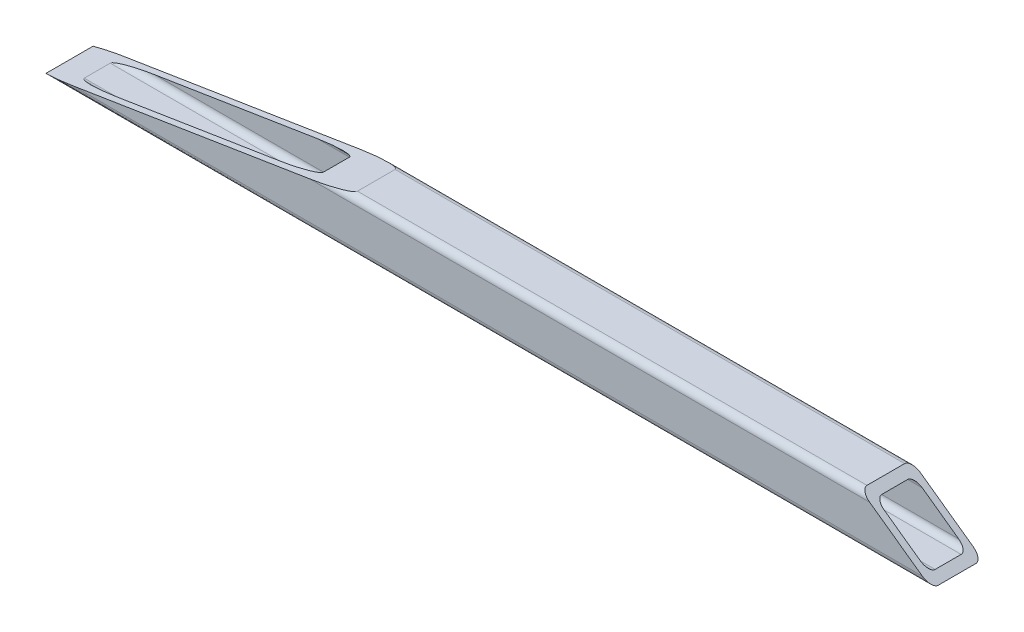
ISO-10303-21;
HEADER;
FILE_DESCRIPTION(('STEP AP214'),'2;1');
FILE_NAME('part.step','',(''),(''),'','','');
FILE_SCHEMA(('AUTOMOTIVE_DESIGN { 1 0 10303 214 1 1 1 1 }'));
ENDSEC;
DATA;
#1=APPLICATION_CONTEXT('core data for automotive mechanical design processes');
#2=APPLICATION_PROTOCOL_DEFINITION('international standard','automotive_design',2000,#1);
#3=PRODUCT_CONTEXT('',#1,'mechanical');
#4=PRODUCT('Part','Part','',(#3));
#5=PRODUCT_RELATED_PRODUCT_CATEGORY('part','',(#4));
#6=PRODUCT_DEFINITION_FORMATION('','',#4);
#7=PRODUCT_DEFINITION_CONTEXT('part definition',#1,'design');
#8=PRODUCT_DEFINITION('design','',#6,#7);
#9=PRODUCT_DEFINITION_SHAPE('','',#8);
#10=(LENGTH_UNIT() NAMED_UNIT(*) SI_UNIT(.MILLI.,.METRE.));
#11=(NAMED_UNIT(*) PLANE_ANGLE_UNIT() SI_UNIT($,.RADIAN.));
#12=(NAMED_UNIT(*) SI_UNIT($,.STERADIAN.) SOLID_ANGLE_UNIT());
#13=UNCERTAINTY_MEASURE_WITH_UNIT(LENGTH_MEASURE(1.E-05),#10,'distance_accuracy_value','');
#14=(GEOMETRIC_REPRESENTATION_CONTEXT(3) GLOBAL_UNCERTAINTY_ASSIGNED_CONTEXT((#13)) GLOBAL_UNIT_ASSIGNED_CONTEXT((#10,
#11,#12)) REPRESENTATION_CONTEXT('',''));
#15=CARTESIAN_POINT('',(0.,0.,0.));
#16=DIRECTION('',(0.,0.,1.));
#17=DIRECTION('',(1.,0.,0.));
#18=AXIS2_PLACEMENT_3D('',#15,#16,#17);
#19=CARTESIAN_POINT('',(442.722,5.25586659147798,-21.257866591478));
#20=DIRECTION('',(0.,0.,1.));
#21=DIRECTION('',(1.,0.,0.));
#22=AXIS2_PLACEMENT_3D('',#19,#20,#21);
#23=PLANE('',#22);
#24=DIRECTION('',(0.987493661121277,0.157658711288962,0.));
#25=VECTOR('',#24,1.);
#26=CARTESIAN_POINT('',(432.535852753679,69.0566915173771,-21.257866591478));
#27=LINE('',#26,#25);
#28=CARTESIAN_POINT('',(32.9200644883551,5.25586659147797,-21.257866591478));
#29=VERTEX_POINT('',#28);
#30=CARTESIAN_POINT('',(114.057305694897,18.209866591478,-21.257866591478));
#31=VERTEX_POINT('',#30);
#32=EDGE_CURVE('E11',#29,#31,#27,.T.);
#33=ORIENTED_EDGE('',*,*,#32,.F.);
#34=DIRECTION('',(-1.,0.,0.));
#35=VECTOR('',#34,1.);
#36=CARTESIAN_POINT('',(442.722,5.25586659147798,-21.257866591478));
#37=LINE('',#36,#35);
#38=CARTESIAN_POINT('',(434.013356726011,5.25586659147798,-21.257866591478));
#39=VERTEX_POINT('',#38);
#40=EDGE_CURVE('E205',#39,#29,#37,.T.);
#41=ORIENTED_EDGE('',*,*,#40,.F.);
#42=DIRECTION('',(0.813621194629576,-0.58139534883721,0.));
#43=VECTOR('',#42,1.);
#44=CARTESIAN_POINT('',(439.778299596407,1.13636848439306,-21.257866591478));
#45=LINE('',#44,#43);
#46=CARTESIAN_POINT('',(415.885160523012,18.209866591478,-21.257866591478));
#47=VERTEX_POINT('',#46);
#48=EDGE_CURVE('E42',#47,#39,#45,.T.);
#49=ORIENTED_EDGE('',*,*,#48,.F.);
#50=DIRECTION('',(-1.,0.,0.));
#51=VECTOR('',#50,1.);
#52=CARTESIAN_POINT('',(442.722,18.209866591478,-21.257866591478));
#53=LINE('',#52,#51);
#54=EDGE_CURVE('E212',#47,#31,#53,.T.);
#55=ORIENTED_EDGE('',*,*,#54,.T.);
#56=EDGE_LOOP('',(#33,#41,#49,#55));
#57=FACE_BOUND('',#56,.T.);
#58=ADVANCED_FACE('F34',(#57),#23,.T.);
#59=CARTESIAN_POINT('',(442.722,5.25586659147798,-18.209866591478));
#60=DIRECTION('',(-1.,0.,0.));
#61=DIRECTION('',(0.,0.,1.));
#62=AXIS2_PLACEMENT_3D('',#59,#60,#61);
#63=CYLINDRICAL_SURFACE('',#62,3.048);
#64=CARTESIAN_POINT('',(32.9200644883551,5.25586659147798,-18.209866591478));
#65=DIRECTION('',(0.157658711288962,-0.987493661121277,0.));
#66=DIRECTION('',(-0.987493661121277,-0.157658711288962,0.));
#67=AXIS2_PLACEMENT_3D('',#64,#65,#66);
#68=ELLIPSE('',#67,19.3328993690271,3.048);
#69=CARTESIAN_POINT('',(13.8289489103454,2.20786659147798,-18.209866591478));
#70=VERTEX_POINT('',#69);
#71=EDGE_CURVE('E263',#70,#29,#68,.T.);
#72=ORIENTED_EDGE('',*,*,#71,.F.);
#73=DIRECTION('',(-1.,0.,0.));
#74=VECTOR('',#73,1.);
#75=CARTESIAN_POINT('',(442.722,2.20786659147798,-18.209866591478));
#76=LINE('',#75,#74);
#77=CARTESIAN_POINT('',(438.278814656128,2.20786659147798,-18.209866591478));
#78=VERTEX_POINT('',#77);
#79=EDGE_CURVE('E207',#78,#70,#76,.T.);
#80=ORIENTED_EDGE('',*,*,#79,.F.);
#81=CARTESIAN_POINT('',(434.013356726011,5.25586659147798,-18.209866591478));
#82=DIRECTION('',(-0.58139534883721,-0.813621194629576,0.));
#83=DIRECTION('',(-0.813621194629576,0.58139534883721,0.));
#84=AXIS2_PLACEMENT_3D('',#81,#82,#83);
#85=ELLIPSE('',#84,5.24255999999999,3.048);
#86=EDGE_CURVE('E194',#39,#78,#85,.T.);
#87=ORIENTED_EDGE('',*,*,#86,.F.);
#88=ORIENTED_EDGE('',*,*,#40,.T.);
#89=EDGE_LOOP('',(#72,#80,#87,#88));
#90=FACE_BOUND('',#89,.T.);
#91=ADVANCED_FACE('F204',(#90),#63,.F.);
#92=CARTESIAN_POINT('',(442.722,2.20786659147798,-5.25586659147798));
#93=DIRECTION('',(0.,1.,0.));
#94=DIRECTION('',(0.,0.,1.));
#95=AXIS2_PLACEMENT_3D('',#92,#93,#94);
#96=PLANE('',#95);
#97=DIRECTION('',(0.,0.,-1.));
#98=VECTOR('',#97,1.);
#99=CARTESIAN_POINT('',(13.8289489103453,2.20786659147798,-5.25586659147798));
#100=LINE('',#99,#98);
#101=CARTESIAN_POINT('',(13.8289489103453,2.20786659147798,-5.25586659147798));
#102=VERTEX_POINT('',#101);
#103=EDGE_CURVE('E265',#102,#70,#100,.T.);
#104=ORIENTED_EDGE('',*,*,#103,.F.);
#105=DIRECTION('',(-1.,0.,0.));
#106=VECTOR('',#105,1.);
#107=CARTESIAN_POINT('',(442.722,2.20786659147798,-5.25586659147798));
#108=LINE('',#107,#106);
#109=CARTESIAN_POINT('',(438.278814656128,2.20786659147798,-5.25586659147798));
#110=VERTEX_POINT('',#109);
#111=EDGE_CURVE('E214',#110,#102,#108,.T.);
#112=ORIENTED_EDGE('',*,*,#111,.F.);
#113=DIRECTION('',(0.,0.,1.));
#114=VECTOR('',#113,1.);
#115=CARTESIAN_POINT('',(438.278814656128,2.20786659147798,-5.25586659147798));
#116=LINE('',#115,#114);
#117=EDGE_CURVE('E208',#78,#110,#116,.T.);
#118=ORIENTED_EDGE('',*,*,#117,.F.);
#119=ORIENTED_EDGE('',*,*,#79,.T.);
#120=EDGE_LOOP('',(#104,#112,#118,#119));
#121=FACE_BOUND('',#120,.T.);
#122=ADVANCED_FACE('F328',(#121),#96,.T.);
#123=CARTESIAN_POINT('',(442.722,5.25586659147798,-5.25586659147798));
#124=DIRECTION('',(-1.,0.,0.));
#125=DIRECTION('',(0.,0.,1.));
#126=AXIS2_PLACEMENT_3D('',#123,#124,#125);
#127=CYLINDRICAL_SURFACE('',#126,3.048);
#128=CARTESIAN_POINT('',(32.9200644883551,5.25586659147798,-5.25586659147798));
#129=DIRECTION('',(0.157658711288962,-0.987493661121277,0.));
#130=DIRECTION('',(-0.987493661121277,-0.157658711288962,0.));
#131=AXIS2_PLACEMENT_3D('',#128,#129,#130);
#132=ELLIPSE('',#131,19.3328993690271,3.048);
#133=CARTESIAN_POINT('',(32.9200644883551,5.25586659147798,-2.20786659147798));
#134=VERTEX_POINT('',#133);
#135=EDGE_CURVE('E271',#134,#102,#132,.T.);
#136=ORIENTED_EDGE('',*,*,#135,.F.);
#137=DIRECTION('',(-1.,0.,0.));
#138=VECTOR('',#137,1.);
#139=CARTESIAN_POINT('',(442.722,5.25586659147798,-2.20786659147798));
#140=LINE('',#139,#138);
#141=CARTESIAN_POINT('',(434.013356726011,5.25586659147798,-2.20786659147798));
#142=VERTEX_POINT('',#141);
#143=EDGE_CURVE('E222',#142,#134,#140,.T.);
#144=ORIENTED_EDGE('',*,*,#143,.F.);
#145=CARTESIAN_POINT('',(434.013356726011,5.25586659147798,-5.25586659147798));
#146=DIRECTION('',(-0.58139534883721,-0.813621194629576,0.));
#147=DIRECTION('',(-0.813621194629576,0.58139534883721,0.));
#148=AXIS2_PLACEMENT_3D('',#145,#146,#147);
#149=ELLIPSE('',#148,5.24255999999999,3.048);
#150=EDGE_CURVE('E301',#110,#142,#149,.T.);
#151=ORIENTED_EDGE('',*,*,#150,.F.);
#152=ORIENTED_EDGE('',*,*,#111,.T.);
#153=EDGE_LOOP('',(#136,#144,#151,#152));
#154=FACE_BOUND('',#153,.T.);
#155=ADVANCED_FACE('F335',(#154),#127,.F.);
#156=CARTESIAN_POINT('',(442.722,5.25586659147798,-2.20786659147798));
#157=DIRECTION('',(0.,0.,-1.));
#158=DIRECTION('',(-1.,0.,0.));
#159=AXIS2_PLACEMENT_3D('',#156,#157,#158);
#160=PLANE('',#159);
#161=DIRECTION('',(-0.987493661121277,-0.157658711288962,0.));
#162=VECTOR('',#161,1.);
#163=CARTESIAN_POINT('',(432.535852753679,69.0566915173771,-2.20786659147798));
#164=LINE('',#163,#162);
#165=CARTESIAN_POINT('',(114.057305694897,18.209866591478,-2.20786659147798));
#166=VERTEX_POINT('',#165);
#167=EDGE_CURVE('E273',#166,#134,#164,.T.);
#168=ORIENTED_EDGE('',*,*,#167,.F.);
#169=DIRECTION('',(-1.,0.,0.));
#170=VECTOR('',#169,1.);
#171=CARTESIAN_POINT('',(442.722,18.209866591478,-2.20786659147798));
#172=LINE('',#171,#170);
#173=CARTESIAN_POINT('',(415.885160523012,18.209866591478,-2.20786659147798));
#174=VERTEX_POINT('',#173);
#175=EDGE_CURVE('E225',#174,#166,#172,.T.);
#176=ORIENTED_EDGE('',*,*,#175,.F.);
#177=DIRECTION('',(-0.813621194629576,0.58139534883721,0.));
#178=VECTOR('',#177,1.);
#179=CARTESIAN_POINT('',(439.778299596407,1.13636848439306,-2.20786659147798));
#180=LINE('',#179,#178);
#181=EDGE_CURVE('E303',#142,#174,#180,.T.);
#182=ORIENTED_EDGE('',*,*,#181,.F.);
#183=ORIENTED_EDGE('',*,*,#143,.T.);
#184=EDGE_LOOP('',(#168,#176,#182,#183));
#185=FACE_BOUND('',#184,.T.);
#186=ADVANCED_FACE('F339',(#185),#160,.T.);
#187=CARTESIAN_POINT('',(442.722,18.209866591478,-5.25586659147798));
#188=DIRECTION('',(-1.,0.,0.));
#189=DIRECTION('',(0.,0.,1.));
#190=AXIS2_PLACEMENT_3D('',#187,#188,#189);
#191=CYLINDRICAL_SURFACE('',#190,3.048);
#192=CARTESIAN_POINT('',(114.057305694897,18.209866591478,-5.25586659147798));
#193=DIRECTION('',(0.157658711288962,-0.987493661121277,0.));
#194=DIRECTION('',(-0.987493661121277,-0.157658711288962,0.));
#195=AXIS2_PLACEMENT_3D('',#192,#193,#194);
#196=ELLIPSE('',#195,19.3328993690271,3.048);
#197=CARTESIAN_POINT('',(133.148421272906,21.257866591478,-5.25586659147798));
#198=VERTEX_POINT('',#197);
#199=EDGE_CURVE('E275',#198,#166,#196,.T.);
#200=ORIENTED_EDGE('',*,*,#199,.F.);
#201=DIRECTION('',(-1.,0.,0.));
#202=VECTOR('',#201,1.);
#203=CARTESIAN_POINT('',(442.722,21.257866591478,-5.25586659147798));
#204=LINE('',#203,#202);
#205=CARTESIAN_POINT('',(411.619702592895,21.257866591478,-5.25586659147798));
#206=VERTEX_POINT('',#205);
#207=EDGE_CURVE('E228',#206,#198,#204,.T.);
#208=ORIENTED_EDGE('',*,*,#207,.F.);
#209=CARTESIAN_POINT('',(415.885160523012,18.209866591478,-5.25586659147798));
#210=DIRECTION('',(-0.58139534883721,-0.813621194629576,0.));
#211=DIRECTION('',(-0.813621194629576,0.58139534883721,0.));
#212=AXIS2_PLACEMENT_3D('',#209,#210,#211);
#213=ELLIPSE('',#212,5.24255999999999,3.048);
#214=EDGE_CURVE('E305',#174,#206,#213,.T.);
#215=ORIENTED_EDGE('',*,*,#214,.F.);
#216=ORIENTED_EDGE('',*,*,#175,.T.);
#217=EDGE_LOOP('',(#200,#208,#215,#216));
#218=FACE_BOUND('',#217,.T.);
#219=ADVANCED_FACE('F343',(#218),#191,.F.);
#220=CARTESIAN_POINT('',(442.722,21.257866591478,-5.25586659147798));
#221=DIRECTION('',(0.,-1.,0.));
#222=DIRECTION('',(0.,0.,-1.));
#223=AXIS2_PLACEMENT_3D('',#220,#221,#222);
#224=PLANE('',#223);
#225=DIRECTION('',(0.,0.,1.));
#226=VECTOR('',#225,1.);
#227=CARTESIAN_POINT('',(133.148421272906,21.257866591478,-5.25586659147798));
#228=LINE('',#227,#226);
#229=CARTESIAN_POINT('',(133.148421272906,21.257866591478,-18.209866591478));
#230=VERTEX_POINT('',#229);
#231=EDGE_CURVE('E277',#230,#198,#228,.T.);
#232=ORIENTED_EDGE('',*,*,#231,.F.);
#233=DIRECTION('',(-1.,0.,0.));
#234=VECTOR('',#233,1.);
#235=CARTESIAN_POINT('',(442.722,21.257866591478,-18.209866591478));
#236=LINE('',#235,#234);
#237=CARTESIAN_POINT('',(411.619702592895,21.257866591478,-18.209866591478));
#238=VERTEX_POINT('',#237);
#239=EDGE_CURVE('E231',#238,#230,#236,.T.);
#240=ORIENTED_EDGE('',*,*,#239,.F.);
#241=DIRECTION('',(0.,0.,-1.));
#242=VECTOR('',#241,1.);
#243=CARTESIAN_POINT('',(411.619702592895,21.257866591478,-5.25586659147798));
#244=LINE('',#243,#242);
#245=EDGE_CURVE('E307',#206,#238,#244,.T.);
#246=ORIENTED_EDGE('',*,*,#245,.F.);
#247=ORIENTED_EDGE('',*,*,#207,.T.);
#248=EDGE_LOOP('',(#232,#240,#246,#247));
#249=FACE_BOUND('',#248,.T.);
#250=ADVANCED_FACE('F347',(#249),#224,.T.);
#251=CARTESIAN_POINT('',(442.722,18.209866591478,-18.209866591478));
#252=DIRECTION('',(-1.,0.,0.));
#253=DIRECTION('',(0.,0.,1.));
#254=AXIS2_PLACEMENT_3D('',#251,#252,#253);
#255=CYLINDRICAL_SURFACE('',#254,3.048);
#256=CARTESIAN_POINT('',(114.057305694897,18.209866591478,-18.209866591478));
#257=DIRECTION('',(0.157658711288962,-0.987493661121277,0.));
#258=DIRECTION('',(-0.987493661121277,-0.157658711288962,0.));
#259=AXIS2_PLACEMENT_3D('',#256,#257,#258);
#260=ELLIPSE('',#259,19.3328993690271,3.048);
#261=EDGE_CURVE('E279',#31,#230,#260,.T.);
#262=ORIENTED_EDGE('',*,*,#261,.F.);
#263=ORIENTED_EDGE('',*,*,#54,.F.);
#264=CARTESIAN_POINT('',(415.885160523012,18.209866591478,-18.209866591478));
#265=DIRECTION('',(-0.58139534883721,-0.813621194629576,0.));
#266=DIRECTION('',(-0.813621194629576,0.58139534883721,0.));
#267=AXIS2_PLACEMENT_3D('',#264,#265,#266);
#268=ELLIPSE('',#267,5.24255999999999,3.048);
#269=EDGE_CURVE('E57',#238,#47,#268,.T.);
#270=ORIENTED_EDGE('',*,*,#269,.F.);
#271=ORIENTED_EDGE('',*,*,#239,.T.);
#272=EDGE_LOOP('',(#262,#263,#270,#271));
#273=FACE_BOUND('',#272,.T.);
#274=ADVANCED_FACE('F351',(#273),#255,.F.);
#275=CARTESIAN_POINT('',(442.722,-0.967133408522038,-24.432866591478));
#276=DIRECTION('',(-0.58139534883721,-0.813621194629576,0.));
#277=DIRECTION('',(0.813621194629576,-0.58139534883721,0.));
#278=AXIS2_PLACEMENT_3D('',#275,#276,#277);
#279=PLANE('',#278);
#280=ORIENTED_EDGE('',*,*,#269,.T.);
#281=ORIENTED_EDGE('',*,*,#48,.T.);
#282=ORIENTED_EDGE('',*,*,#86,.T.);
#283=ORIENTED_EDGE('',*,*,#117,.T.);
#284=ORIENTED_EDGE('',*,*,#150,.T.);
#285=ORIENTED_EDGE('',*,*,#181,.T.);
#286=ORIENTED_EDGE('',*,*,#214,.T.);
#287=ORIENTED_EDGE('',*,*,#245,.T.);
#288=EDGE_LOOP('',(#280,#281,#282,#283,#284,#285,#286,#287));
#289=FACE_BOUND('',#288,.T.);
#290=DIRECTION('',(0.813621194629576,-0.58139534883721,0.));
#291=VECTOR('',#290,1.);
#292=CARTESIAN_POINT('',(442.722,-0.967133408522038,-24.432866591478));
#293=LINE('',#292,#291);
#294=CARTESIAN_POINT('',(411.79743000665,21.130866591478,-24.432866591478));
#295=VERTEX_POINT('',#294);
#296=CARTESIAN_POINT('',(438.101087242373,2.33486659147797,-24.432866591478));
#297=VERTEX_POINT('',#296);
#298=EDGE_CURVE('E173',#295,#297,#293,.T.);
#299=ORIENTED_EDGE('',*,*,#298,.F.);
#300=CARTESIAN_POINT('',(411.79743000665,21.130866591478,-21.130866591478));
#301=DIRECTION('',(-0.58139534883721,-0.813621194629576,0.));
#302=DIRECTION('',(-0.813621194629576,0.58139534883721,0.));
#303=AXIS2_PLACEMENT_3D('',#300,#301,#302);
#304=ELLIPSE('',#303,5.67944000000002,3.30200000000002);
#305=CARTESIAN_POINT('',(407.176517249023,24.432866591478,-21.130866591478));
#306=VERTEX_POINT('',#305);
#307=EDGE_CURVE('E162',#306,#295,#304,.T.);
#308=ORIENTED_EDGE('',*,*,#307,.F.);
#309=DIRECTION('',(0.,0.,1.));
#310=VECTOR('',#309,1.);
#311=CARTESIAN_POINT('',(407.176517249023,24.432866591478,-24.432866591478));
#312=LINE('',#311,#310);
#313=CARTESIAN_POINT('',(407.176517249023,24.432866591478,-2.33486659147798));
#314=VERTEX_POINT('',#313);
#315=EDGE_CURVE('E157',#306,#314,#312,.T.);
#316=ORIENTED_EDGE('',*,*,#315,.T.);
#317=CARTESIAN_POINT('',(411.79743000665,21.130866591478,-2.33486659147798));
#318=DIRECTION('',(-0.58139534883721,-0.813621194629576,0.));
#319=DIRECTION('',(-0.813621194629576,0.58139534883721,0.));
#320=AXIS2_PLACEMENT_3D('',#317,#318,#319);
#321=ELLIPSE('',#320,5.67944000000002,3.30200000000001);
#322=CARTESIAN_POINT('',(411.79743000665,21.130866591478,0.967133408522034));
#323=VERTEX_POINT('',#322);
#324=EDGE_CURVE('E151',#323,#314,#321,.T.);
#325=ORIENTED_EDGE('',*,*,#324,.F.);
#326=DIRECTION('',(0.813621194629576,-0.58139534883721,0.));
#327=VECTOR('',#326,1.);
#328=CARTESIAN_POINT('',(442.722,-0.967133408522038,0.967133408522034));
#329=LINE('',#328,#327);
#330=CARTESIAN_POINT('',(438.101087242373,2.33486659147798,0.967133408522034));
#331=VERTEX_POINT('',#330);
#332=EDGE_CURVE('E154',#323,#331,#329,.T.);
#333=ORIENTED_EDGE('',*,*,#332,.T.);
#334=CARTESIAN_POINT('',(438.101087242373,2.33486659147798,-2.33486659147798));
#335=DIRECTION('',(-0.58139534883721,-0.813621194629576,0.));
#336=DIRECTION('',(-0.813621194629576,0.58139534883721,0.));
#337=AXIS2_PLACEMENT_3D('',#334,#335,#336);
#338=ELLIPSE('',#337,5.67944000000002,3.30200000000002);
#339=CARTESIAN_POINT('',(442.722,-0.967133408522038,-2.33486659147798));
#340=VERTEX_POINT('',#339);
#341=EDGE_CURVE('E163',#340,#331,#338,.T.);
#342=ORIENTED_EDGE('',*,*,#341,.F.);
#343=DIRECTION('',(0.,0.,-1.));
#344=VECTOR('',#343,1.);
#345=CARTESIAN_POINT('',(442.722,-0.967133408522038,-2.33486659147798));
#346=LINE('',#345,#344);
#347=CARTESIAN_POINT('',(442.722,-0.967133408522038,-21.130866591478));
#348=VERTEX_POINT('',#347);
#349=EDGE_CURVE('E235',#340,#348,#346,.T.);
#350=ORIENTED_EDGE('',*,*,#349,.T.);
#351=CARTESIAN_POINT('',(438.101087242373,2.33486659147798,-21.130866591478));
#352=DIRECTION('',(-0.58139534883721,-0.813621194629576,0.));
#353=DIRECTION('',(-0.813621194629576,0.58139534883721,0.));
#354=AXIS2_PLACEMENT_3D('',#351,#352,#353);
#355=ELLIPSE('',#354,5.67944000000001,3.30200000000001);
#356=EDGE_CURVE('E261',#297,#348,#355,.T.);
#357=ORIENTED_EDGE('',*,*,#356,.F.);
#358=EDGE_LOOP('',(#299,#308,#316,#325,#333,#342,#350,#357));
#359=FACE_BOUND('',#358,.T.);
#360=ADVANCED_FACE('F153',(#289,#359),#279,.F.);
#361=CARTESIAN_POINT('',(0.,0.,-24.432866591478));
#362=DIRECTION('',(0.157658711288962,-0.987493661121277,0.));
#363=DIRECTION('',(0.987493661121277,0.157658711288962,0.));
#364=AXIS2_PLACEMENT_3D('',#361,#362,#363);
#365=PLANE('',#364);
#366=ORIENTED_EDGE('',*,*,#261,.T.);
#367=ORIENTED_EDGE('',*,*,#231,.T.);
#368=ORIENTED_EDGE('',*,*,#199,.T.);
#369=ORIENTED_EDGE('',*,*,#167,.T.);
#370=ORIENTED_EDGE('',*,*,#135,.T.);
#371=ORIENTED_EDGE('',*,*,#103,.T.);
#372=ORIENTED_EDGE('',*,*,#71,.T.);
#373=ORIENTED_EDGE('',*,*,#32,.T.);
#374=EDGE_LOOP('',(#366,#367,#368,#369,#370,#371,#372,#373));
#375=FACE_BOUND('',#374,.T.);
#376=DIRECTION('',(0.,0.,1.));
#377=VECTOR('',#376,1.);
#378=CARTESIAN_POINT('',(0.,0.,-24.432866591478));
#379=LINE('',#378,#377);
#380=CARTESIAN_POINT('',(0.,0.,-23.465733182956));
#381=VERTEX_POINT('',#380);
#382=CARTESIAN_POINT('',(0.,0.,0.));
#383=VERTEX_POINT('',#382);
#384=EDGE_CURVE('E49',#381,#383,#379,.T.);
#385=ORIENTED_EDGE('',*,*,#384,.T.);
#386=CARTESIAN_POINT('',(14.624412059429,2.33486659147798,-2.33486659147798));
#387=DIRECTION('',(0.157658711288962,-0.987493661121277,0.));
#388=DIRECTION('',(-0.987493661121277,-0.157658711288962,0.));
#389=AXIS2_PLACEMENT_3D('',#386,#387,#388);
#390=ELLIPSE('',#389,20.9439743164461,3.30200000000002);
#391=CARTESIAN_POINT('',(14.62441205943,2.33486659147806,0.967133408522034));
#392=VERTEX_POINT('',#391);
#393=EDGE_CURVE('E281',#392,#383,#390,.T.);
#394=ORIENTED_EDGE('',*,*,#393,.F.);
#395=DIRECTION('',(0.987493661121277,0.157658711288962,0.));
#396=VECTOR('',#395,1.);
#397=CARTESIAN_POINT('',(0.,0.,0.967133408522034));
#398=LINE('',#397,#396);
#399=CARTESIAN_POINT('',(132.352958123823,21.130866591478,0.967133408522034));
#400=VERTEX_POINT('',#399);
#401=EDGE_CURVE('E294',#392,#400,#398,.T.);
#402=ORIENTED_EDGE('',*,*,#401,.T.);
#403=CARTESIAN_POINT('',(132.352958123823,21.130866591478,-2.33486659147798));
#404=DIRECTION('',(0.157658711288962,-0.987493661121277,0.));
#405=DIRECTION('',(-0.987493661121277,-0.157658711288962,0.));
#406=AXIS2_PLACEMENT_3D('',#403,#404,#405);
#407=ELLIPSE('',#406,20.9439743164461,3.30200000000001);
#408=CARTESIAN_POINT('',(153.035,24.432866591478,-2.33486659147798));
#409=VERTEX_POINT('',#408);
#410=EDGE_CURVE('E177',#409,#400,#407,.T.);
#411=ORIENTED_EDGE('',*,*,#410,.F.);
#412=DIRECTION('',(0.,0.,1.));
#413=VECTOR('',#412,1.);
#414=CARTESIAN_POINT('',(153.035,24.432866591478,-24.432866591478));
#415=LINE('',#414,#413);
#416=CARTESIAN_POINT('',(153.035,24.432866591478,-21.130866591478));
#417=VERTEX_POINT('',#416);
#418=EDGE_CURVE('E209',#417,#409,#415,.T.);
#419=ORIENTED_EDGE('',*,*,#418,.F.);
#420=CARTESIAN_POINT('',(132.352958123823,21.130866591478,-21.130866591478));
#421=DIRECTION('',(0.157658711288962,-0.987493661121277,0.));
#422=DIRECTION('',(-0.987493661121277,-0.157658711288962,0.));
#423=AXIS2_PLACEMENT_3D('',#420,#421,#422);
#424=ELLIPSE('',#423,20.9439743164461,3.30200000000002);
#425=CARTESIAN_POINT('',(132.352958123823,21.130866591478,-24.432866591478));
#426=VERTEX_POINT('',#425);
#427=EDGE_CURVE('E284',#426,#417,#424,.T.);
#428=ORIENTED_EDGE('',*,*,#427,.F.);
#429=DIRECTION('',(0.987493661121277,0.157658711288962,0.));
#430=VECTOR('',#429,1.);
#431=CARTESIAN_POINT('',(0.,0.,-24.432866591478));
#432=LINE('',#431,#430);
#433=CARTESIAN_POINT('',(14.6244120594289,2.33486659147796,-24.432866591478));
#434=VERTEX_POINT('',#433);
#435=EDGE_CURVE('E296',#434,#426,#432,.T.);
#436=ORIENTED_EDGE('',*,*,#435,.F.);
#437=CARTESIAN_POINT('',(14.624412059429,2.33486659147798,-21.130866591478));
#438=DIRECTION('',(0.157658711288962,-0.987493661121277,0.));
#439=DIRECTION('',(-0.987493661121277,-0.157658711288962,0.));
#440=AXIS2_PLACEMENT_3D('',#437,#438,#439);
#441=ELLIPSE('',#440,20.9439743164461,3.30200000000001);
#442=EDGE_CURVE('E216',#381,#434,#441,.T.);
#443=ORIENTED_EDGE('',*,*,#442,.F.);
#444=EDGE_LOOP('',(#385,#394,#402,#411,#419,#428,#436,#443));
#445=FACE_BOUND('',#444,.T.);
#446=ADVANCED_FACE('F311',(#375,#445),#365,.F.);
#447=CARTESIAN_POINT('',(0.,2.33486659147798,-21.130866591478));
#448=DIRECTION('',(1.,0.,0.));
#449=DIRECTION('',(0.,0.,-1.));
#450=AXIS2_PLACEMENT_3D('',#447,#448,#449);
#451=PLANE('',#450);
#452=CARTESIAN_POINT('',(0.,2.33486659147798,-2.33486659147798));
#453=DIRECTION('',(1.,0.,0.));
#454=DIRECTION('',(0.,0.,1.));
#455=AXIS2_PLACEMENT_3D('',#452,#453,#454);
#456=CIRCLE('',#455,3.30200000000002);
#457=CARTESIAN_POINT('',(0.,-0.967133408522038,-2.33486659147798));
#458=VERTEX_POINT('',#457);
#459=EDGE_CURVE('E241',#383,#458,#456,.T.);
#460=ORIENTED_EDGE('',*,*,#459,.F.);
#461=ORIENTED_EDGE('',*,*,#384,.F.);
#462=CARTESIAN_POINT('',(0.,2.33486659147798,-21.130866591478));
#463=DIRECTION('',(1.,0.,0.));
#464=DIRECTION('',(0.,0.,-1.));
#465=AXIS2_PLACEMENT_3D('',#462,#463,#464);
#466=CIRCLE('',#465,3.30200000000001);
#467=CARTESIAN_POINT('',(0.,-0.967133408522034,-21.130866591478));
#468=VERTEX_POINT('',#467);
#469=EDGE_CURVE('E234',#468,#381,#466,.T.);
#470=ORIENTED_EDGE('',*,*,#469,.F.);
#471=DIRECTION('',(0.,0.,-1.));
#472=VECTOR('',#471,1.);
#473=CARTESIAN_POINT('',(0.,-0.967133408522038,-2.33486659147798));
#474=LINE('',#473,#472);
#475=EDGE_CURVE('E238',#458,#468,#474,.T.);
#476=ORIENTED_EDGE('',*,*,#475,.F.);
#477=EDGE_LOOP('',(#460,#461,#470,#476));
#478=FACE_BOUND('',#477,.T.);
#479=ADVANCED_FACE('F256',(#478),#451,.F.);
#480=CARTESIAN_POINT('',(442.722,2.33486659147798,-21.130866591478));
#481=DIRECTION('',(-1.,0.,0.));
#482=DIRECTION('',(0.,0.,1.));
#483=AXIS2_PLACEMENT_3D('',#480,#481,#482);
#484=CYLINDRICAL_SURFACE('',#483,3.30200000000001);
#485=ORIENTED_EDGE('',*,*,#469,.T.);
#486=ORIENTED_EDGE('',*,*,#442,.T.);
#487=DIRECTION('',(-1.,0.,0.));
#488=VECTOR('',#487,1.);
#489=CARTESIAN_POINT('',(442.722,2.33486659147798,-24.432866591478));
#490=LINE('',#489,#488);
#491=EDGE_CURVE('E191',#297,#434,#490,.T.);
#492=ORIENTED_EDGE('',*,*,#491,.F.);
#493=ORIENTED_EDGE('',*,*,#356,.T.);
#494=DIRECTION('',(-1.,0.,0.));
#495=VECTOR('',#494,1.);
#496=CARTESIAN_POINT('',(442.722,-0.967133408522034,-21.130866591478));
#497=LINE('',#496,#495);
#498=EDGE_CURVE('E237',#348,#468,#497,.T.);
#499=ORIENTED_EDGE('',*,*,#498,.T.);
#500=EDGE_LOOP('',(#485,#486,#492,#493,#499));
#501=FACE_BOUND('',#500,.T.);
#502=ADVANCED_FACE('F36',(#501),#484,.T.);
#503=CARTESIAN_POINT('',(442.722,2.33486659147798,-24.432866591478));
#504=DIRECTION('',(0.,0.,1.));
#505=DIRECTION('',(1.,0.,0.));
#506=AXIS2_PLACEMENT_3D('',#503,#504,#505);
#507=PLANE('',#506);
#508=ORIENTED_EDGE('',*,*,#491,.T.);
#509=ORIENTED_EDGE('',*,*,#435,.T.);
#510=DIRECTION('',(-1.,0.,0.));
#511=VECTOR('',#510,1.);
#512=CARTESIAN_POINT('',(442.722,21.130866591478,-24.432866591478));
#513=LINE('',#512,#511);
#514=EDGE_CURVE('E188',#295,#426,#513,.T.);
#515=ORIENTED_EDGE('',*,*,#514,.F.);
#516=ORIENTED_EDGE('',*,*,#298,.T.);
#517=EDGE_LOOP('',(#508,#509,#515,#516));
#518=FACE_BOUND('',#517,.T.);
#519=ADVANCED_FACE('F316',(#518),#507,.F.);
#520=CARTESIAN_POINT('',(442.722,21.130866591478,-21.130866591478));
#521=DIRECTION('',(-1.,0.,0.));
#522=DIRECTION('',(0.,0.,1.));
#523=AXIS2_PLACEMENT_3D('',#520,#521,#522);
#524=CYLINDRICAL_SURFACE('',#523,3.30200000000002);
#525=ORIENTED_EDGE('',*,*,#514,.T.);
#526=ORIENTED_EDGE('',*,*,#427,.T.);
#527=DIRECTION('',(-1.,0.,0.));
#528=VECTOR('',#527,1.);
#529=CARTESIAN_POINT('',(442.722,24.432866591478,-21.130866591478));
#530=LINE('',#529,#528);
#531=EDGE_CURVE('E180',#306,#417,#530,.T.);
#532=ORIENTED_EDGE('',*,*,#531,.F.);
#533=ORIENTED_EDGE('',*,*,#307,.T.);
#534=EDGE_LOOP('',(#525,#526,#532,#533));
#535=FACE_BOUND('',#534,.T.);
#536=ADVANCED_FACE('F288',(#535),#524,.T.);
#537=CARTESIAN_POINT('',(442.722,24.432866591478,-2.33486659147798));
#538=DIRECTION('',(0.,-1.,0.));
#539=DIRECTION('',(0.,0.,-1.));
#540=AXIS2_PLACEMENT_3D('',#537,#538,#539);
#541=PLANE('',#540);
#542=ORIENTED_EDGE('',*,*,#531,.T.);
#543=ORIENTED_EDGE('',*,*,#418,.T.);
#544=DIRECTION('',(-1.,0.,0.));
#545=VECTOR('',#544,1.);
#546=CARTESIAN_POINT('',(442.722,24.432866591478,-2.33486659147798));
#547=LINE('',#546,#545);
#548=EDGE_CURVE('E178',#314,#409,#547,.T.);
#549=ORIENTED_EDGE('',*,*,#548,.F.);
#550=ORIENTED_EDGE('',*,*,#315,.F.);
#551=EDGE_LOOP('',(#542,#543,#549,#550));
#552=FACE_BOUND('',#551,.T.);
#553=ADVANCED_FACE('F293',(#552),#541,.F.);
#554=CARTESIAN_POINT('',(442.722,21.130866591478,-2.33486659147798));
#555=DIRECTION('',(-1.,0.,0.));
#556=DIRECTION('',(0.,0.,1.));
#557=AXIS2_PLACEMENT_3D('',#554,#555,#556);
#558=CYLINDRICAL_SURFACE('',#557,3.30200000000001);
#559=ORIENTED_EDGE('',*,*,#548,.T.);
#560=ORIENTED_EDGE('',*,*,#410,.T.);
#561=DIRECTION('',(-1.,0.,0.));
#562=VECTOR('',#561,1.);
#563=CARTESIAN_POINT('',(442.722,21.130866591478,0.967133408522034));
#564=LINE('',#563,#562);
#565=EDGE_CURVE('E170',#323,#400,#564,.T.);
#566=ORIENTED_EDGE('',*,*,#565,.F.);
#567=ORIENTED_EDGE('',*,*,#324,.T.);
#568=EDGE_LOOP('',(#559,#560,#566,#567));
#569=FACE_BOUND('',#568,.T.);
#570=ADVANCED_FACE('F176',(#569),#558,.T.);
#571=CARTESIAN_POINT('',(442.722,2.33486659147798,0.967133408522034));
#572=DIRECTION('',(0.,0.,-1.));
#573=DIRECTION('',(-1.,0.,0.));
#574=AXIS2_PLACEMENT_3D('',#571,#572,#573);
#575=PLANE('',#574);
#576=ORIENTED_EDGE('',*,*,#565,.T.);
#577=ORIENTED_EDGE('',*,*,#401,.F.);
#578=DIRECTION('',(-1.,0.,0.));
#579=VECTOR('',#578,1.);
#580=CARTESIAN_POINT('',(442.722,2.33486659147798,0.967133408522035));
#581=LINE('',#580,#579);
#582=EDGE_CURVE('E172',#331,#392,#581,.T.);
#583=ORIENTED_EDGE('',*,*,#582,.F.);
#584=ORIENTED_EDGE('',*,*,#332,.F.);
#585=EDGE_LOOP('',(#576,#577,#583,#584));
#586=FACE_BOUND('',#585,.T.);
#587=ADVANCED_FACE('F168',(#586),#575,.F.);
#588=CARTESIAN_POINT('',(442.722,2.33486659147798,-2.33486659147798));
#589=DIRECTION('',(-1.,0.,0.));
#590=DIRECTION('',(0.,0.,1.));
#591=AXIS2_PLACEMENT_3D('',#588,#589,#590);
#592=CYLINDRICAL_SURFACE('',#591,3.30200000000002);
#593=ORIENTED_EDGE('',*,*,#582,.T.);
#594=ORIENTED_EDGE('',*,*,#393,.T.);
#595=ORIENTED_EDGE('',*,*,#459,.T.);
#596=DIRECTION('',(-1.,0.,0.));
#597=VECTOR('',#596,1.);
#598=CARTESIAN_POINT('',(442.722,-0.967133408522038,-2.33486659147798));
#599=LINE('',#598,#597);
#600=EDGE_CURVE('E182',#340,#458,#599,.T.);
#601=ORIENTED_EDGE('',*,*,#600,.F.);
#602=ORIENTED_EDGE('',*,*,#341,.T.);
#603=EDGE_LOOP('',(#593,#594,#595,#601,#602));
#604=FACE_BOUND('',#603,.T.);
#605=ADVANCED_FACE('F310',(#604),#592,.T.);
#606=CARTESIAN_POINT('',(442.722,-0.967133408522038,-2.33486659147798));
#607=DIRECTION('',(0.,1.,0.));
#608=DIRECTION('',(0.,0.,1.));
#609=AXIS2_PLACEMENT_3D('',#606,#607,#608);
#610=PLANE('',#609);
#611=ORIENTED_EDGE('',*,*,#475,.T.);
#612=ORIENTED_EDGE('',*,*,#498,.F.);
#613=ORIENTED_EDGE('',*,*,#349,.F.);
#614=ORIENTED_EDGE('',*,*,#600,.T.);
#615=EDGE_LOOP('',(#611,#612,#613,#614));
#616=FACE_BOUND('',#615,.T.);
#617=ADVANCED_FACE('F250',(#616),#610,.F.);
#618=CLOSED_SHELL('',(#58,#91,#122,#155,#186,#219,#250,#274,#360,#446,#479,#502,#519,#536,#553,
#570,#587,#605,#617));
#619=MANIFOLD_SOLID_BREP('B2',#618);
#620=ADVANCED_BREP_SHAPE_REPRESENTATION('',(#18,#619),#14);
#621=SHAPE_DEFINITION_REPRESENTATION(#9,#620);
ENDSEC;
END-ISO-10303-21;
